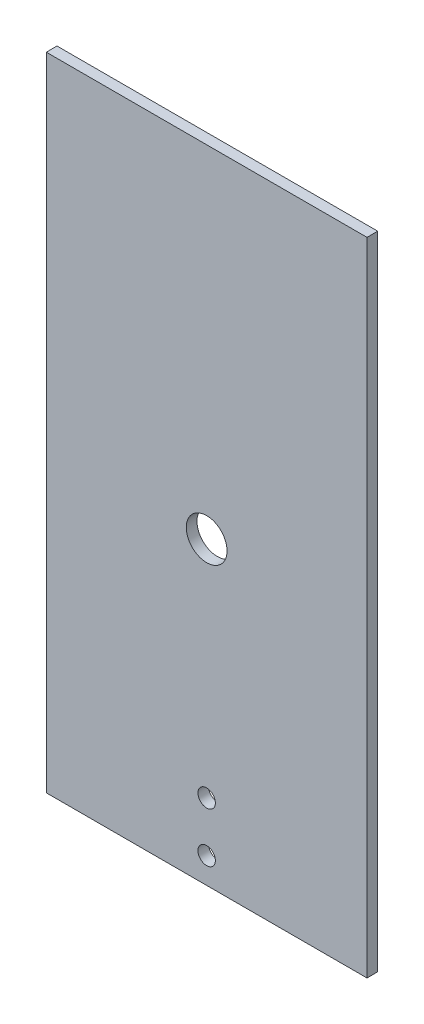
ISO-10303-21;
HEADER;
FILE_DESCRIPTION(('STEP AP214'),'2;1');
FILE_NAME('part.step','',(''),(''),'','','');
FILE_SCHEMA(('AUTOMOTIVE_DESIGN { 1 0 10303 214 1 1 1 1 }'));
ENDSEC;
DATA;
#1=APPLICATION_CONTEXT('core data for automotive mechanical design processes');
#2=APPLICATION_PROTOCOL_DEFINITION('international standard','automotive_design',2000,#1);
#3=PRODUCT_CONTEXT('',#1,'mechanical');
#4=PRODUCT('Part','Part','',(#3));
#5=PRODUCT_RELATED_PRODUCT_CATEGORY('part','',(#4));
#6=PRODUCT_DEFINITION_FORMATION('','',#4);
#7=PRODUCT_DEFINITION_CONTEXT('part definition',#1,'design');
#8=PRODUCT_DEFINITION('design','',#6,#7);
#9=PRODUCT_DEFINITION_SHAPE('','',#8);
#10=(LENGTH_UNIT() NAMED_UNIT(*) SI_UNIT(.MILLI.,.METRE.));
#11=(NAMED_UNIT(*) PLANE_ANGLE_UNIT() SI_UNIT($,.RADIAN.));
#12=(NAMED_UNIT(*) SI_UNIT($,.STERADIAN.) SOLID_ANGLE_UNIT());
#13=UNCERTAINTY_MEASURE_WITH_UNIT(LENGTH_MEASURE(1.E-05),#10,'distance_accuracy_value','');
#14=(GEOMETRIC_REPRESENTATION_CONTEXT(3) GLOBAL_UNCERTAINTY_ASSIGNED_CONTEXT((#13)) GLOBAL_UNIT_ASSIGNED_CONTEXT((#10,
#11,#12)) REPRESENTATION_CONTEXT('',''));
#15=CARTESIAN_POINT('',(0.,0.,0.));
#16=DIRECTION('',(0.,0.,1.));
#17=DIRECTION('',(1.,0.,0.));
#18=AXIS2_PLACEMENT_3D('',#15,#16,#17);
#19=CARTESIAN_POINT('',(30.,19.1605938281405,2.));
#20=DIRECTION('',(-1.,0.,0.));
#21=DIRECTION('',(0.,0.,1.));
#22=AXIS2_PLACEMENT_3D('',#19,#20,#21);
#23=PLANE('',#22);
#24=DIRECTION('',(0.,1.,0.));
#25=VECTOR('',#24,1.);
#26=CARTESIAN_POINT('',(30.,19.1605938281405,0.));
#27=LINE('',#26,#25);
#28=CARTESIAN_POINT('',(30.,19.1605938281405,0.));
#29=VERTEX_POINT('',#28);
#30=CARTESIAN_POINT('',(30.,139.16059382814,0.));
#31=VERTEX_POINT('',#30);
#32=EDGE_CURVE('E100',#29,#31,#27,.T.);
#33=ORIENTED_EDGE('',*,*,#32,.T.);
#34=DIRECTION('',(0.,0.,-1.));
#35=VECTOR('',#34,1.);
#36=CARTESIAN_POINT('',(30.,139.16059382814,2.));
#37=LINE('',#36,#35);
#38=CARTESIAN_POINT('',(30.,139.16059382814,2.));
#39=VERTEX_POINT('',#38);
#40=EDGE_CURVE('E11',#39,#31,#37,.T.);
#41=ORIENTED_EDGE('',*,*,#40,.F.);
#42=DIRECTION('',(0.,1.,0.));
#43=VECTOR('',#42,1.);
#44=CARTESIAN_POINT('',(30.,19.1605938281405,2.));
#45=LINE('',#44,#43);
#46=CARTESIAN_POINT('',(30.,19.1605938281405,2.));
#47=VERTEX_POINT('',#46);
#48=EDGE_CURVE('E87',#47,#39,#45,.T.);
#49=ORIENTED_EDGE('',*,*,#48,.F.);
#50=DIRECTION('',(0.,0.,-1.));
#51=VECTOR('',#50,1.);
#52=CARTESIAN_POINT('',(30.,19.1605938281405,2.));
#53=LINE('',#52,#51);
#54=EDGE_CURVE('E96',#47,#29,#53,.T.);
#55=ORIENTED_EDGE('',*,*,#54,.T.);
#56=EDGE_LOOP('',(#33,#41,#49,#55));
#57=FACE_BOUND('',#56,.T.);
#58=ADVANCED_FACE('F35',(#57),#23,.F.);
#59=CARTESIAN_POINT('',(30.,139.16059382814,2.));
#60=DIRECTION('',(0.,-1.,0.));
#61=DIRECTION('',(0.,0.,-1.));
#62=AXIS2_PLACEMENT_3D('',#59,#60,#61);
#63=PLANE('',#62);
#64=DIRECTION('',(-1.,0.,0.));
#65=VECTOR('',#64,1.);
#66=CARTESIAN_POINT('',(30.,139.16059382814,0.));
#67=LINE('',#66,#65);
#68=CARTESIAN_POINT('',(-30.,139.16059382814,0.));
#69=VERTEX_POINT('',#68);
#70=EDGE_CURVE('E91',#31,#69,#67,.T.);
#71=ORIENTED_EDGE('',*,*,#70,.T.);
#72=DIRECTION('',(0.,0.,-1.));
#73=VECTOR('',#72,1.);
#74=CARTESIAN_POINT('',(-30.,139.16059382814,2.));
#75=LINE('',#74,#73);
#76=CARTESIAN_POINT('',(-30.,139.16059382814,2.));
#77=VERTEX_POINT('',#76);
#78=EDGE_CURVE('E44',#77,#69,#75,.T.);
#79=ORIENTED_EDGE('',*,*,#78,.F.);
#80=DIRECTION('',(-1.,0.,0.));
#81=VECTOR('',#80,1.);
#82=CARTESIAN_POINT('',(30.,139.16059382814,2.));
#83=LINE('',#82,#81);
#84=EDGE_CURVE('E82',#39,#77,#83,.T.);
#85=ORIENTED_EDGE('',*,*,#84,.F.);
#86=ORIENTED_EDGE('',*,*,#40,.T.);
#87=EDGE_LOOP('',(#71,#79,#85,#86));
#88=FACE_BOUND('',#87,.T.);
#89=ADVANCED_FACE('F90',(#88),#63,.F.);
#90=CARTESIAN_POINT('',(-30.,19.1605938281405,2.));
#91=DIRECTION('',(1.,0.,0.));
#92=DIRECTION('',(0.,0.,-1.));
#93=AXIS2_PLACEMENT_3D('',#90,#91,#92);
#94=PLANE('',#93);
#95=DIRECTION('',(0.,-1.,0.));
#96=VECTOR('',#95,1.);
#97=CARTESIAN_POINT('',(-30.,19.1605938281405,0.));
#98=LINE('',#97,#96);
#99=CARTESIAN_POINT('',(-30.,19.1605938281405,0.));
#100=VERTEX_POINT('',#99);
#101=EDGE_CURVE('E69',#69,#100,#98,.T.);
#102=ORIENTED_EDGE('',*,*,#101,.T.);
#103=DIRECTION('',(0.,0.,-1.));
#104=VECTOR('',#103,1.);
#105=CARTESIAN_POINT('',(-30.,19.1605938281405,2.));
#106=LINE('',#105,#104);
#107=CARTESIAN_POINT('',(-30.,19.1605938281405,2.));
#108=VERTEX_POINT('',#107);
#109=EDGE_CURVE('E92',#108,#100,#106,.T.);
#110=ORIENTED_EDGE('',*,*,#109,.F.);
#111=DIRECTION('',(0.,-1.,0.));
#112=VECTOR('',#111,1.);
#113=CARTESIAN_POINT('',(-30.,19.1605938281405,2.));
#114=LINE('',#113,#112);
#115=EDGE_CURVE('E85',#77,#108,#114,.T.);
#116=ORIENTED_EDGE('',*,*,#115,.F.);
#117=ORIENTED_EDGE('',*,*,#78,.T.);
#118=EDGE_LOOP('',(#102,#110,#116,#117));
#119=FACE_BOUND('',#118,.T.);
#120=ADVANCED_FACE('F94',(#119),#94,.F.);
#121=CARTESIAN_POINT('',(30.,19.1605938281405,2.));
#122=DIRECTION('',(0.,1.,0.));
#123=DIRECTION('',(0.,0.,1.));
#124=AXIS2_PLACEMENT_3D('',#121,#122,#123);
#125=PLANE('',#124);
#126=DIRECTION('',(1.,0.,0.));
#127=VECTOR('',#126,1.);
#128=CARTESIAN_POINT('',(30.,19.1605938281405,0.));
#129=LINE('',#128,#127);
#130=EDGE_CURVE('E75',#100,#29,#129,.T.);
#131=ORIENTED_EDGE('',*,*,#130,.T.);
#132=ORIENTED_EDGE('',*,*,#54,.F.);
#133=DIRECTION('',(1.,0.,0.));
#134=VECTOR('',#133,1.);
#135=CARTESIAN_POINT('',(30.,19.1605938281405,2.));
#136=LINE('',#135,#134);
#137=EDGE_CURVE('E52',#108,#47,#136,.T.);
#138=ORIENTED_EDGE('',*,*,#137,.F.);
#139=ORIENTED_EDGE('',*,*,#109,.T.);
#140=EDGE_LOOP('',(#131,#132,#138,#139));
#141=FACE_BOUND('',#140,.T.);
#142=ADVANCED_FACE('F108',(#141),#125,.F.);
#143=CARTESIAN_POINT('',(30.,139.16059382814,2.));
#144=DIRECTION('',(0.,0.,1.));
#145=DIRECTION('',(1.,0.,0.));
#146=AXIS2_PLACEMENT_3D('',#143,#144,#145);
#147=PLANE('',#146);
#148=CARTESIAN_POINT('',(0.,33.332,2.));
#149=DIRECTION('',(0.,0.,1.));
#150=DIRECTION('',(1.,0.,0.));
#151=AXIS2_PLACEMENT_3D('',#148,#149,#150);
#152=CIRCLE('',#151,1.63194999999999);
#153=CARTESIAN_POINT('',(1.63194999999999,33.332,2.));
#154=VERTEX_POINT('',#153);
#155=EDGE_CURVE('E125',#154,#154,#152,.T.);
#156=ORIENTED_EDGE('',*,*,#155,.F.);
#157=EDGE_LOOP('',(#156));
#158=FACE_BOUND('',#157,.T.);
#159=CARTESIAN_POINT('',(0.,23.992,2.));
#160=DIRECTION('',(0.,0.,1.));
#161=DIRECTION('',(1.,0.,0.));
#162=AXIS2_PLACEMENT_3D('',#159,#160,#161);
#163=CIRCLE('',#162,1.63194999999999);
#164=CARTESIAN_POINT('',(1.63194999999999,23.992,2.));
#165=VERTEX_POINT('',#164);
#166=EDGE_CURVE('E122',#165,#165,#163,.T.);
#167=ORIENTED_EDGE('',*,*,#166,.F.);
#168=EDGE_LOOP('',(#167));
#169=FACE_BOUND('',#168,.T.);
#170=CARTESIAN_POINT('',(0.,75.261,2.));
#171=DIRECTION('',(0.,0.,-1.));
#172=DIRECTION('',(-1.,0.,0.));
#173=AXIS2_PLACEMENT_3D('',#170,#171,#172);
#174=CIRCLE('',#173,3.81437511723841);
#175=CARTESIAN_POINT('',(-3.81437511723841,75.261,2.));
#176=VERTEX_POINT('',#175);
#177=EDGE_CURVE('E103',#176,#176,#174,.T.);
#178=ORIENTED_EDGE('',*,*,#177,.T.);
#179=EDGE_LOOP('',(#178));
#180=FACE_BOUND('',#179,.T.);
#181=ORIENTED_EDGE('',*,*,#48,.T.);
#182=ORIENTED_EDGE('',*,*,#84,.T.);
#183=ORIENTED_EDGE('',*,*,#115,.T.);
#184=ORIENTED_EDGE('',*,*,#137,.T.);
#185=EDGE_LOOP('',(#181,#182,#183,#184));
#186=FACE_BOUND('',#185,.T.);
#187=ADVANCED_FACE('F83',(#158,#169,#180,#186),#147,.T.);
#188=CARTESIAN_POINT('',(30.,139.16059382814,0.));
#189=DIRECTION('',(0.,0.,1.));
#190=DIRECTION('',(1.,0.,0.));
#191=AXIS2_PLACEMENT_3D('',#188,#189,#190);
#192=PLANE('',#191);
#193=CARTESIAN_POINT('',(0.,33.332,0.));
#194=DIRECTION('',(0.,0.,1.));
#195=DIRECTION('',(1.,0.,0.));
#196=AXIS2_PLACEMENT_3D('',#193,#194,#195);
#197=CIRCLE('',#196,1.63194999999999);
#198=CARTESIAN_POINT('',(1.63194999999999,33.332,0.));
#199=VERTEX_POINT('',#198);
#200=EDGE_CURVE('E38',#199,#199,#197,.T.);
#201=ORIENTED_EDGE('',*,*,#200,.T.);
#202=EDGE_LOOP('',(#201));
#203=FACE_BOUND('',#202,.T.);
#204=CARTESIAN_POINT('',(0.,23.992,0.));
#205=DIRECTION('',(0.,0.,1.));
#206=DIRECTION('',(1.,0.,0.));
#207=AXIS2_PLACEMENT_3D('',#204,#205,#206);
#208=CIRCLE('',#207,1.63194999999999);
#209=CARTESIAN_POINT('',(1.63194999999999,23.992,0.));
#210=VERTEX_POINT('',#209);
#211=EDGE_CURVE('E117',#210,#210,#208,.T.);
#212=ORIENTED_EDGE('',*,*,#211,.T.);
#213=EDGE_LOOP('',(#212));
#214=FACE_BOUND('',#213,.T.);
#215=CARTESIAN_POINT('',(0.,75.261,0.));
#216=DIRECTION('',(0.,0.,-1.));
#217=DIRECTION('',(-1.,0.,0.));
#218=AXIS2_PLACEMENT_3D('',#215,#216,#217);
#219=CIRCLE('',#218,3.81437511723841);
#220=CARTESIAN_POINT('',(-3.81437511723841,75.261,0.));
#221=VERTEX_POINT('',#220);
#222=EDGE_CURVE('E114',#221,#221,#219,.T.);
#223=ORIENTED_EDGE('',*,*,#222,.F.);
#224=EDGE_LOOP('',(#223));
#225=FACE_BOUND('',#224,.T.);
#226=ORIENTED_EDGE('',*,*,#32,.F.);
#227=ORIENTED_EDGE('',*,*,#130,.F.);
#228=ORIENTED_EDGE('',*,*,#101,.F.);
#229=ORIENTED_EDGE('',*,*,#70,.F.);
#230=EDGE_LOOP('',(#226,#227,#228,#229));
#231=FACE_BOUND('',#230,.T.);
#232=ADVANCED_FACE('F111',(#203,#214,#225,#231),#192,.F.);
#233=CARTESIAN_POINT('',(0.,75.261,2.));
#234=DIRECTION('',(0.,0.,-1.));
#235=DIRECTION('',(-1.,0.,0.));
#236=AXIS2_PLACEMENT_3D('',#233,#234,#235);
#237=CYLINDRICAL_SURFACE('',#236,3.81437511723841);
#238=ORIENTED_EDGE('',*,*,#177,.F.);
#239=EDGE_LOOP('',(#238));
#240=FACE_BOUND('',#239,.T.);
#241=ORIENTED_EDGE('',*,*,#222,.T.);
#242=EDGE_LOOP('',(#241));
#243=FACE_BOUND('',#242,.T.);
#244=ADVANCED_FACE('F141',(#240,#243),#237,.F.);
#245=CARTESIAN_POINT('',(0.,23.992,2.));
#246=DIRECTION('',(0.,0.,1.));
#247=DIRECTION('',(1.,0.,0.));
#248=AXIS2_PLACEMENT_3D('',#245,#246,#247);
#249=CYLINDRICAL_SURFACE('',#248,1.63194999999999);
#250=ORIENTED_EDGE('',*,*,#166,.T.);
#251=EDGE_LOOP('',(#250));
#252=FACE_BOUND('',#251,.T.);
#253=ORIENTED_EDGE('',*,*,#211,.F.);
#254=EDGE_LOOP('',(#253));
#255=FACE_BOUND('',#254,.T.);
#256=ADVANCED_FACE('F136',(#252,#255),#249,.F.);
#257=CARTESIAN_POINT('',(0.,33.332,2.));
#258=DIRECTION('',(0.,0.,1.));
#259=DIRECTION('',(1.,0.,0.));
#260=AXIS2_PLACEMENT_3D('',#257,#258,#259);
#261=CYLINDRICAL_SURFACE('',#260,1.63194999999999);
#262=ORIENTED_EDGE('',*,*,#155,.T.);
#263=EDGE_LOOP('',(#262));
#264=FACE_BOUND('',#263,.T.);
#265=ORIENTED_EDGE('',*,*,#200,.F.);
#266=EDGE_LOOP('',(#265));
#267=FACE_BOUND('',#266,.T.);
#268=ADVANCED_FACE('F134',(#264,#267),#261,.F.);
#269=CLOSED_SHELL('',(#58,#89,#120,#142,#187,#232,#244,#256,#268));
#270=MANIFOLD_SOLID_BREP('B2',#269);
#271=ADVANCED_BREP_SHAPE_REPRESENTATION('',(#18,#270),#14);
#272=SHAPE_DEFINITION_REPRESENTATION(#9,#271);
ENDSEC;
END-ISO-10303-21;
